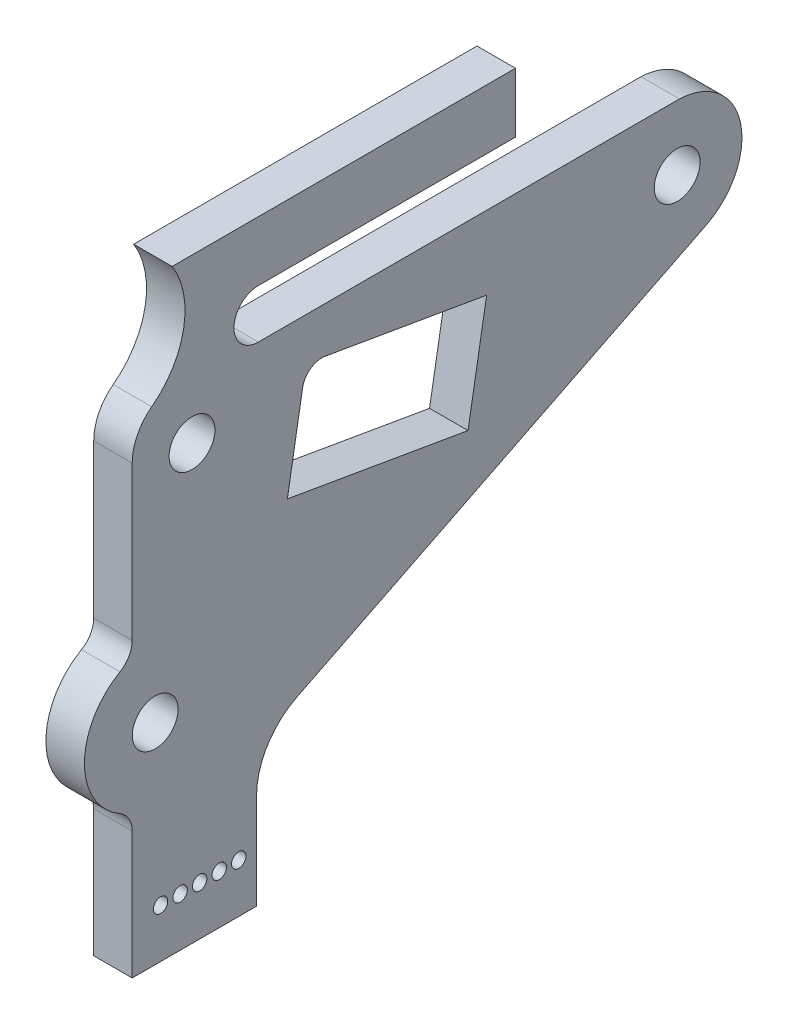
ISO-10303-21;
HEADER;
FILE_DESCRIPTION(('STEP AP214'),'2;1');
FILE_NAME('part.step','',(''),(''),'','','');
FILE_SCHEMA(('AUTOMOTIVE_DESIGN { 1 0 10303 214 1 1 1 1 }'));
ENDSEC;
DATA;
#1=APPLICATION_CONTEXT('core data for automotive mechanical design processes');
#2=APPLICATION_PROTOCOL_DEFINITION('international standard','automotive_design',2000,#1);
#3=PRODUCT_CONTEXT('',#1,'mechanical');
#4=PRODUCT('Part','Part','',(#3));
#5=PRODUCT_RELATED_PRODUCT_CATEGORY('part','',(#4));
#6=PRODUCT_DEFINITION_FORMATION('','',#4);
#7=PRODUCT_DEFINITION_CONTEXT('part definition',#1,'design');
#8=PRODUCT_DEFINITION('design','',#6,#7);
#9=PRODUCT_DEFINITION_SHAPE('','',#8);
#10=(LENGTH_UNIT() NAMED_UNIT(*) SI_UNIT(.MILLI.,.METRE.));
#11=(NAMED_UNIT(*) PLANE_ANGLE_UNIT() SI_UNIT($,.RADIAN.));
#12=(NAMED_UNIT(*) SI_UNIT($,.STERADIAN.) SOLID_ANGLE_UNIT());
#13=UNCERTAINTY_MEASURE_WITH_UNIT(LENGTH_MEASURE(1.E-05),#10,'distance_accuracy_value','');
#14=(GEOMETRIC_REPRESENTATION_CONTEXT(3) GLOBAL_UNCERTAINTY_ASSIGNED_CONTEXT((#13)) GLOBAL_UNIT_ASSIGNED_CONTEXT((#10,
#11,#12)) REPRESENTATION_CONTEXT('',''));
#15=CARTESIAN_POINT('',(0.,0.,0.));
#16=DIRECTION('',(0.,0.,1.));
#17=DIRECTION('',(1.,0.,0.));
#18=AXIS2_PLACEMENT_3D('',#15,#16,#17);
#19=CARTESIAN_POINT('',(2.,2.38699131838962,51.5454002273468));
#20=DIRECTION('',(-1.,0.,0.));
#21=DIRECTION('',(0.,0.,1.));
#22=AXIS2_PLACEMENT_3D('',#19,#20,#21);
#23=PLANE('',#22);
#24=CARTESIAN_POINT('',(2.,-38.8637496349809,53.6810864751904));
#25=DIRECTION('',(1.,0.,0.));
#26=DIRECTION('',(0.,0.,-1.));
#27=AXIS2_PLACEMENT_3D('',#24,#25,#26);
#28=CIRCLE('',#27,0.749999999999999);
#29=CARTESIAN_POINT('',(2.,-38.8637496349809,52.9310864751904));
#30=VERTEX_POINT('',#29);
#31=EDGE_CURVE('E233',#30,#30,#28,.T.);
#32=ORIENTED_EDGE('',*,*,#31,.F.);
#33=EDGE_LOOP('',(#32));
#34=FACE_BOUND('',#33,.T.);
#35=CARTESIAN_POINT('',(2.,0.,0.));
#36=DIRECTION('',(1.,0.,0.));
#37=DIRECTION('',(0.,0.,-1.));
#38=AXIS2_PLACEMENT_3D('',#35,#36,#37);
#39=CIRCLE('',#38,2.38125);
#40=CARTESIAN_POINT('',(2.,0.,-2.38125));
#41=VERTEX_POINT('',#40);
#42=EDGE_CURVE('E239',#41,#41,#39,.T.);
#43=ORIENTED_EDGE('',*,*,#42,.F.);
#44=EDGE_LOOP('',(#43));
#45=FACE_BOUND('',#44,.T.);
#46=CARTESIAN_POINT('',(2.,2.38699131838962,51.5454002273468));
#47=DIRECTION('',(1.,0.,0.));
#48=DIRECTION('',(0.,0.,1.));
#49=AXIS2_PLACEMENT_3D('',#46,#47,#48);
#50=CIRCLE('',#49,5.08);
#51=CARTESIAN_POINT('',(2.,6.4482806199041,54.5970111477303));
#52=VERTEX_POINT('',#51);
#53=CARTESIAN_POINT('',(2.,2.38699131838962,56.6254002273468));
#54=VERTEX_POINT('',#53);
#55=EDGE_CURVE('E245',#52,#54,#50,.T.);
#56=ORIENTED_EDGE('',*,*,#55,.T.);
#57=DIRECTION('',(0.,-1.,0.));
#58=VECTOR('',#57,1.);
#59=CARTESIAN_POINT('',(2.,2.38699131838962,56.6254002273468));
#60=LINE('',#59,#58);
#61=CARTESIAN_POINT('',(2.,-13.5592215366912,56.6254002273468));
#62=VERTEX_POINT('',#61);
#63=EDGE_CURVE('E248',#54,#62,#60,.T.);
#64=ORIENTED_EDGE('',*,*,#63,.T.);
#65=CARTESIAN_POINT('',(2.,-13.5592215366912,59.1654002273468));
#66=DIRECTION('',(-1.,0.,0.));
#67=DIRECTION('',(0.,0.,1.));
#68=AXIS2_PLACEMENT_3D('',#65,#66,#67);
#69=CIRCLE('',#68,2.54);
#70=CARTESIAN_POINT('',(2.,-15.7615105365102,57.8998872241437));
#71=VERTEX_POINT('',#70);
#72=EDGE_CURVE('E251',#62,#71,#69,.T.);
#73=ORIENTED_EDGE('',*,*,#72,.T.);
#74=CARTESIAN_POINT('',(2.,-22.137211246104,54.2361845251858));
#75=DIRECTION('',(1.,0.,0.));
#76=DIRECTION('',(0.,0.,-1.));
#77=AXIS2_PLACEMENT_3D('',#74,#75,#76);
#78=CIRCLE('',#77,7.35338541113316);
#79=CARTESIAN_POINT('',(2.,-28.5129119556978,57.8998872241436));
#80=VERTEX_POINT('',#79);
#81=EDGE_CURVE('E253',#71,#80,#78,.T.);
#82=ORIENTED_EDGE('',*,*,#81,.T.);
#83=CARTESIAN_POINT('',(2.,-30.7152009555168,59.1654002273467));
#84=DIRECTION('',(-1.,0.,0.));
#85=DIRECTION('',(0.,0.,-1.));
#86=AXIS2_PLACEMENT_3D('',#83,#84,#85);
#87=CIRCLE('',#86,2.54);
#88=CARTESIAN_POINT('',(2.,-30.7152009555168,56.6254002273467));
#89=VERTEX_POINT('',#88);
#90=EDGE_CURVE('E255',#80,#89,#87,.T.);
#91=ORIENTED_EDGE('',*,*,#90,.T.);
#92=DIRECTION('',(0.,-1.,0.));
#93=VECTOR('',#92,1.);
#94=CARTESIAN_POINT('',(2.,-30.7152009555168,56.6254002273467));
#95=LINE('',#94,#93);
#96=CARTESIAN_POINT('',(2.,-43.9437496349808,56.6254002273467));
#97=VERTEX_POINT('',#96);
#98=EDGE_CURVE('E257',#89,#97,#95,.T.);
#99=ORIENTED_EDGE('',*,*,#98,.T.);
#100=DIRECTION('',(0.,0.,-1.));
#101=VECTOR('',#100,1.);
#102=CARTESIAN_POINT('',(2.,-43.9437496349808,56.6254002273467));
#103=LINE('',#102,#101);
#104=CARTESIAN_POINT('',(2.,-43.9437496349808,43.7075206472883));
#105=VERTEX_POINT('',#104);
#106=EDGE_CURVE('E259',#97,#105,#103,.T.);
#107=ORIENTED_EDGE('',*,*,#106,.T.);
#108=DIRECTION('',(0.,1.,0.));
#109=VECTOR('',#108,1.);
#110=CARTESIAN_POINT('',(2.,-43.9437496349808,43.7075206472883));
#111=LINE('',#110,#109);
#112=CARTESIAN_POINT('',(2.,-34.03041401143,43.7075206472883));
#113=VERTEX_POINT('',#112);
#114=EDGE_CURVE('E261',#105,#113,#111,.T.);
#115=ORIENTED_EDGE('',*,*,#114,.T.);
#116=CARTESIAN_POINT('',(2.,-34.03041401143,36.0875206472883));
#117=DIRECTION('',(-1.,0.,0.));
#118=DIRECTION('',(0.,0.,1.));
#119=AXIS2_PLACEMENT_3D('',#116,#117,#118);
#120=CIRCLE('',#119,7.62);
#121=CARTESIAN_POINT('',(2.,-27.2112146301632,39.4879500023156));
#122=VERTEX_POINT('',#121);
#123=EDGE_CURVE('E263',#113,#122,#120,.T.);
#124=ORIENTED_EDGE('',*,*,#123,.T.);
#125=DIRECTION('',(0.,0.446250571525895,-0.894908055284347));
#126=VECTOR('',#125,1.);
#127=CARTESIAN_POINT('',(2.,-20.3900423288693,25.8088144932282));
#128=LINE('',#127,#126);
#129=CARTESIAN_POINT('',(2.,-6.02274455486092,-3.00327299982475));
#130=VERTEX_POINT('',#129);
#131=EDGE_CURVE('E265',#122,#130,#128,.T.);
#132=ORIENTED_EDGE('',*,*,#131,.T.);
#133=CARTESIAN_POINT('',(2.,0.,0.));
#134=DIRECTION('',(1.,0.,0.));
#135=DIRECTION('',(0.,0.,1.));
#136=AXIS2_PLACEMENT_3D('',#133,#134,#135);
#137=CIRCLE('',#136,6.73001490968506);
#138=CARTESIAN_POINT('',(2.,6.72598374953626,-0.232901879677734));
#139=VERTEX_POINT('',#138);
#140=EDGE_CURVE('E267',#130,#139,#137,.T.);
#141=ORIENTED_EDGE('',*,*,#140,.T.);
#142=DIRECTION('',(0.,0.,1.));
#143=VECTOR('',#142,1.);
#144=CARTESIAN_POINT('',(2.,6.72598374953626,43.5151442643136));
#145=LINE('',#144,#143);
#146=CARTESIAN_POINT('',(2.,6.72598374953626,43.5151442643136));
#147=VERTEX_POINT('',#146);
#148=EDGE_CURVE('E269',#139,#147,#145,.T.);
#149=ORIENTED_EDGE('',*,*,#148,.T.);
#150=CARTESIAN_POINT('',(2.,9.26598374953626,43.5151442643136));
#151=DIRECTION('',(-1.,0.,0.));
#152=DIRECTION('',(0.,0.,1.));
#153=AXIS2_PLACEMENT_3D('',#150,#151,#152);
#154=CIRCLE('',#153,2.54);
#155=CARTESIAN_POINT('',(2.,11.8059837495363,43.5151442643136));
#156=VERTEX_POINT('',#155);
#157=EDGE_CURVE('E271',#147,#156,#154,.T.);
#158=ORIENTED_EDGE('',*,*,#157,.T.);
#159=DIRECTION('',(0.,0.,-1.));
#160=VECTOR('',#159,1.);
#161=CARTESIAN_POINT('',(2.,11.8059837495363,43.5151442643136));
#162=LINE('',#161,#160);
#163=CARTESIAN_POINT('',(2.,11.8059837495363,16.8039920927754));
#164=VERTEX_POINT('',#163);
#165=EDGE_CURVE('E273',#156,#164,#162,.T.);
#166=ORIENTED_EDGE('',*,*,#165,.T.);
#167=DIRECTION('',(0.,1.,0.));
#168=VECTOR('',#167,1.);
#169=CARTESIAN_POINT('',(2.,11.8059837495363,16.8039920927754));
#170=LINE('',#169,#168);
#171=CARTESIAN_POINT('',(2.,18.0090250290164,16.8039920927754));
#172=VERTEX_POINT('',#171);
#173=EDGE_CURVE('E275',#164,#172,#170,.T.);
#174=ORIENTED_EDGE('',*,*,#173,.T.);
#175=DIRECTION('',(0.,0.,1.));
#176=VECTOR('',#175,1.);
#177=CARTESIAN_POINT('',(2.,18.0090250290164,16.8039920927754));
#178=LINE('',#177,#176);
#179=CARTESIAN_POINT('',(2.,18.0090250290164,52.4757765292634));
#180=VERTEX_POINT('',#179);
#181=EDGE_CURVE('E277',#172,#180,#178,.T.);
#182=ORIENTED_EDGE('',*,*,#181,.T.);
#183=CARTESIAN_POINT('',(2.,13.3787632863439,59.8045043889899));
#184=DIRECTION('',(-1.,0.,0.));
#185=DIRECTION('',(0.,0.,1.));
#186=AXIS2_PLACEMENT_3D('',#183,#184,#185);
#187=CIRCLE('',#186,8.66888550204626);
#188=EDGE_CURVE('E279',#180,#52,#187,.T.);
#189=ORIENTED_EDGE('',*,*,#188,.T.);
#190=EDGE_LOOP('',(#56,#64,#73,#82,#91,#99,#107,#115,#124,#132,#141,#149,#158,#166,#174,#182,#189));
#191=FACE_BOUND('',#190,.T.);
#192=DIRECTION('',(0.,0.985468507772832,-0.169858235561272));
#193=VECTOR('',#192,1.);
#194=CARTESIAN_POINT('',(2.,-0.914638547086267,19.7976944461285));
#195=LINE('',#194,#193);
#196=CARTESIAN_POINT('',(2.,-12.1305272597709,21.7308978432555));
#197=VERTEX_POINT('',#196);
#198=CARTESIAN_POINT('',(2.,-0.914638547086267,19.7976944461285));
#199=VERTEX_POINT('',#198);
#200=EDGE_CURVE('E186',#197,#199,#195,.T.);
#201=ORIENTED_EDGE('',*,*,#200,.F.);
#202=DIRECTION('',(0.,-0.169858235561271,-0.985468507772832));
#203=VECTOR('',#202,1.);
#204=CARTESIAN_POINT('',(2.,-8.89472787232872,40.504072916328));
#205=LINE('',#204,#203);
#206=CARTESIAN_POINT('',(2.,-8.89472787232872,40.504072916328));
#207=VERTEX_POINT('',#206);
#208=EDGE_CURVE('E215',#207,#197,#205,.T.);
#209=ORIENTED_EDGE('',*,*,#208,.F.);
#210=DIRECTION('',(0.,-0.985468507772832,0.169858235561271));
#211=VECTOR('',#210,1.);
#212=CARTESIAN_POINT('',(2.,0.318688832561539,38.9160214538614));
#213=LINE('',#212,#211);
#214=CARTESIAN_POINT('',(2.,0.318688832561539,38.9160214538614));
#215=VERTEX_POINT('',#214);
#216=EDGE_CURVE('E210',#215,#207,#213,.T.);
#217=ORIENTED_EDGE('',*,*,#216,.F.);
#218=CARTESIAN_POINT('',(2.,-0.02646310209895,36.913549446067));
#219=DIRECTION('',(1.,0.,0.));
#220=DIRECTION('',(0.,0.,1.));
#221=AXIS2_PLACEMENT_3D('',#218,#219,#220);
#222=CIRCLE('',#221,2.032);
#223=CARTESIAN_POINT('',(2.,1.97600890569544,36.5683975114065));
#224=VERTEX_POINT('',#223);
#225=EDGE_CURVE('E208',#224,#215,#222,.T.);
#226=ORIENTED_EDGE('',*,*,#225,.F.);
#227=DIRECTION('',(0.,0.169858235561271,0.985468507772832));
#228=VECTOR('',#227,1.);
#229=CARTESIAN_POINT('',(2.,1.97600890569544,36.5683975114065));
#230=LINE('',#229,#228);
#231=EDGE_CURVE('E194',#199,#224,#230,.T.);
#232=ORIENTED_EDGE('',*,*,#231,.F.);
#233=EDGE_LOOP('',(#201,#209,#217,#226,#232));
#234=FACE_BOUND('',#233,.T.);
#235=CARTESIAN_POINT('',(2.,-38.8637496349808,45.5530864751904));
#236=DIRECTION('',(1.,0.,0.));
#237=DIRECTION('',(0.,0.,-1.));
#238=AXIS2_PLACEMENT_3D('',#235,#236,#237);
#239=CIRCLE('',#238,0.749999999999999);
#240=CARTESIAN_POINT('',(2.,-38.8637496349808,44.8030864751904));
#241=VERTEX_POINT('',#240);
#242=EDGE_CURVE('E218',#241,#241,#239,.T.);
#243=ORIENTED_EDGE('',*,*,#242,.F.);
#244=EDGE_LOOP('',(#243));
#245=FACE_BOUND('',#244,.T.);
#246=CARTESIAN_POINT('',(2.,-22.137211246104,54.2361845251858));
#247=DIRECTION('',(1.,0.,0.));
#248=DIRECTION('',(0.,0.,-1.));
#249=AXIS2_PLACEMENT_3D('',#246,#247,#248);
#250=CIRCLE('',#249,2.38125);
#251=CARTESIAN_POINT('',(2.,-22.137211246104,51.8549345251858));
#252=VERTEX_POINT('',#251);
#253=EDGE_CURVE('E757',#252,#252,#250,.T.);
#254=ORIENTED_EDGE('',*,*,#253,.F.);
#255=EDGE_LOOP('',(#254));
#256=FACE_BOUND('',#255,.T.);
#257=CARTESIAN_POINT('',(2.,-38.8637496349808,47.5850864751904));
#258=DIRECTION('',(1.,0.,0.));
#259=DIRECTION('',(0.,0.,-1.));
#260=AXIS2_PLACEMENT_3D('',#257,#258,#259);
#261=CIRCLE('',#260,0.749999999999999);
#262=CARTESIAN_POINT('',(2.,-38.8637496349808,46.8350864751904));
#263=VERTEX_POINT('',#262);
#264=EDGE_CURVE('E751',#263,#263,#261,.T.);
#265=ORIENTED_EDGE('',*,*,#264,.F.);
#266=EDGE_LOOP('',(#265));
#267=FACE_BOUND('',#266,.T.);
#268=CARTESIAN_POINT('',(2.,-38.8637496349808,49.6170864751904));
#269=DIRECTION('',(1.,0.,0.));
#270=DIRECTION('',(0.,0.,-1.));
#271=AXIS2_PLACEMENT_3D('',#268,#269,#270);
#272=CIRCLE('',#271,0.749999999999999);
#273=CARTESIAN_POINT('',(2.,-38.8637496349808,48.8670864751904));
#274=VERTEX_POINT('',#273);
#275=EDGE_CURVE('E745',#274,#274,#272,.T.);
#276=ORIENTED_EDGE('',*,*,#275,.F.);
#277=EDGE_LOOP('',(#276));
#278=FACE_BOUND('',#277,.T.);
#279=CARTESIAN_POINT('',(2.,-38.8637496349809,51.6490864751904));
#280=DIRECTION('',(1.,0.,0.));
#281=DIRECTION('',(0.,0.,-1.));
#282=AXIS2_PLACEMENT_3D('',#279,#280,#281);
#283=CIRCLE('',#282,0.749999999999999);
#284=CARTESIAN_POINT('',(2.,-38.8637496349809,50.8990864751904));
#285=VERTEX_POINT('',#284);
#286=EDGE_CURVE('E739',#285,#285,#283,.T.);
#287=ORIENTED_EDGE('',*,*,#286,.F.);
#288=EDGE_LOOP('',(#287));
#289=FACE_BOUND('',#288,.T.);
#290=CARTESIAN_POINT('',(2.,1.07937569190719,50.4101289105847));
#291=DIRECTION('',(1.,0.,0.));
#292=DIRECTION('',(0.,0.,-1.));
#293=AXIS2_PLACEMENT_3D('',#290,#291,#292);
#294=CIRCLE('',#293,2.38125);
#295=CARTESIAN_POINT('',(2.,1.07937569190719,48.0288789105847));
#296=VERTEX_POINT('',#295);
#297=EDGE_CURVE('E730',#296,#296,#294,.T.);
#298=ORIENTED_EDGE('',*,*,#297,.F.);
#299=EDGE_LOOP('',(#298));
#300=FACE_BOUND('',#299,.T.);
#301=ADVANCED_FACE('F37',(#34,#45,#191,#234,#245,#256,#267,#278,#289,#300),#23,.F.);
#302=CARTESIAN_POINT('',(-2.,2.38699131838962,51.5454002273468));
#303=DIRECTION('',(-1.,0.,0.));
#304=DIRECTION('',(0.,0.,1.));
#305=AXIS2_PLACEMENT_3D('',#302,#303,#304);
#306=PLANE('',#305);
#307=CARTESIAN_POINT('',(-2.,-38.8637496349809,51.6490864751904));
#308=DIRECTION('',(1.,0.,0.));
#309=DIRECTION('',(0.,0.,-1.));
#310=AXIS2_PLACEMENT_3D('',#307,#308,#309);
#311=CIRCLE('',#310,0.749999999999999);
#312=CARTESIAN_POINT('',(-2.,-38.8637496349809,50.8990864751904));
#313=VERTEX_POINT('',#312);
#314=EDGE_CURVE('E736',#313,#313,#311,.T.);
#315=ORIENTED_EDGE('',*,*,#314,.T.);
#316=EDGE_LOOP('',(#315));
#317=FACE_BOUND('',#316,.T.);
#318=CARTESIAN_POINT('',(-2.,-38.8637496349808,47.5850864751904));
#319=DIRECTION('',(1.,0.,0.));
#320=DIRECTION('',(0.,0.,-1.));
#321=AXIS2_PLACEMENT_3D('',#318,#319,#320);
#322=CIRCLE('',#321,0.749999999999999);
#323=CARTESIAN_POINT('',(-2.,-38.8637496349808,46.8350864751904));
#324=VERTEX_POINT('',#323);
#325=EDGE_CURVE('E748',#324,#324,#322,.T.);
#326=ORIENTED_EDGE('',*,*,#325,.T.);
#327=EDGE_LOOP('',(#326));
#328=FACE_BOUND('',#327,.T.);
#329=CARTESIAN_POINT('',(-2.,-38.8637496349808,45.5530864751904));
#330=DIRECTION('',(1.,0.,0.));
#331=DIRECTION('',(0.,0.,-1.));
#332=AXIS2_PLACEMENT_3D('',#329,#330,#331);
#333=CIRCLE('',#332,0.749999999999999);
#334=CARTESIAN_POINT('',(-2.,-38.8637496349808,44.8030864751904));
#335=VERTEX_POINT('',#334);
#336=EDGE_CURVE('E760',#335,#335,#333,.T.);
#337=ORIENTED_EDGE('',*,*,#336,.T.);
#338=EDGE_LOOP('',(#337));
#339=FACE_BOUND('',#338,.T.);
#340=CARTESIAN_POINT('',(-2.,0.,0.));
#341=DIRECTION('',(1.,0.,0.));
#342=DIRECTION('',(0.,0.,-1.));
#343=AXIS2_PLACEMENT_3D('',#340,#341,#342);
#344=CIRCLE('',#343,2.38125);
#345=CARTESIAN_POINT('',(-2.,0.,-2.38125));
#346=VERTEX_POINT('',#345);
#347=EDGE_CURVE('E236',#346,#346,#344,.T.);
#348=ORIENTED_EDGE('',*,*,#347,.T.);
#349=EDGE_LOOP('',(#348));
#350=FACE_BOUND('',#349,.T.);
#351=CARTESIAN_POINT('',(-2.,2.38699131838962,51.5454002273468));
#352=DIRECTION('',(1.,0.,0.));
#353=DIRECTION('',(0.,0.,1.));
#354=AXIS2_PLACEMENT_3D('',#351,#352,#353);
#355=CIRCLE('',#354,5.08);
#356=CARTESIAN_POINT('',(-2.,6.4482806199041,54.5970111477303));
#357=VERTEX_POINT('',#356);
#358=CARTESIAN_POINT('',(-2.,2.38699131838962,56.6254002273468));
#359=VERTEX_POINT('',#358);
#360=EDGE_CURVE('E242',#357,#359,#355,.T.);
#361=ORIENTED_EDGE('',*,*,#360,.F.);
#362=CARTESIAN_POINT('',(-2.,13.3787632863439,59.8045043889899));
#363=DIRECTION('',(-1.,0.,0.));
#364=DIRECTION('',(0.,0.,1.));
#365=AXIS2_PLACEMENT_3D('',#362,#363,#364);
#366=CIRCLE('',#365,8.66888550204626);
#367=CARTESIAN_POINT('',(-2.,18.0090250290164,52.4757765292634));
#368=VERTEX_POINT('',#367);
#369=EDGE_CURVE('E249',#368,#357,#366,.T.);
#370=ORIENTED_EDGE('',*,*,#369,.F.);
#371=DIRECTION('',(0.,0.,1.));
#372=VECTOR('',#371,1.);
#373=CARTESIAN_POINT('',(-2.,18.0090250290164,16.8039920927754));
#374=LINE('',#373,#372);
#375=CARTESIAN_POINT('',(-2.,18.0090250290164,16.8039920927754));
#376=VERTEX_POINT('',#375);
#377=EDGE_CURVE('E313',#376,#368,#374,.T.);
#378=ORIENTED_EDGE('',*,*,#377,.F.);
#379=DIRECTION('',(0.,1.,0.));
#380=VECTOR('',#379,1.);
#381=CARTESIAN_POINT('',(-2.,11.8059837495363,16.8039920927754));
#382=LINE('',#381,#380);
#383=CARTESIAN_POINT('',(-2.,11.8059837495363,16.8039920927754));
#384=VERTEX_POINT('',#383);
#385=EDGE_CURVE('E311',#384,#376,#382,.T.);
#386=ORIENTED_EDGE('',*,*,#385,.F.);
#387=DIRECTION('',(0.,0.,-1.));
#388=VECTOR('',#387,1.);
#389=CARTESIAN_POINT('',(-2.,11.8059837495363,43.5151442643136));
#390=LINE('',#389,#388);
#391=CARTESIAN_POINT('',(-2.,11.8059837495363,43.5151442643136));
#392=VERTEX_POINT('',#391);
#393=EDGE_CURVE('E309',#392,#384,#390,.T.);
#394=ORIENTED_EDGE('',*,*,#393,.F.);
#395=CARTESIAN_POINT('',(-2.,9.26598374953626,43.5151442643136));
#396=DIRECTION('',(-1.,0.,0.));
#397=DIRECTION('',(0.,0.,1.));
#398=AXIS2_PLACEMENT_3D('',#395,#396,#397);
#399=CIRCLE('',#398,2.54);
#400=CARTESIAN_POINT('',(-2.,6.72598374953626,43.5151442643136));
#401=VERTEX_POINT('',#400);
#402=EDGE_CURVE('E307',#401,#392,#399,.T.);
#403=ORIENTED_EDGE('',*,*,#402,.F.);
#404=DIRECTION('',(0.,0.,1.));
#405=VECTOR('',#404,1.);
#406=CARTESIAN_POINT('',(-2.,6.72598374953626,43.5151442643136));
#407=LINE('',#406,#405);
#408=CARTESIAN_POINT('',(-2.,6.72598374953626,-0.232901879677734));
#409=VERTEX_POINT('',#408);
#410=EDGE_CURVE('E305',#409,#401,#407,.T.);
#411=ORIENTED_EDGE('',*,*,#410,.F.);
#412=CARTESIAN_POINT('',(-2.,0.,0.));
#413=DIRECTION('',(1.,0.,0.));
#414=DIRECTION('',(0.,0.,1.));
#415=AXIS2_PLACEMENT_3D('',#412,#413,#414);
#416=CIRCLE('',#415,6.73001490968506);
#417=CARTESIAN_POINT('',(-2.,-6.02274455486092,-3.00327299982475));
#418=VERTEX_POINT('',#417);
#419=EDGE_CURVE('E303',#418,#409,#416,.T.);
#420=ORIENTED_EDGE('',*,*,#419,.F.);
#421=DIRECTION('',(0.,0.446250571525895,-0.894908055284347));
#422=VECTOR('',#421,1.);
#423=CARTESIAN_POINT('',(-2.,-20.3900423288693,25.8088144932282));
#424=LINE('',#423,#422);
#425=CARTESIAN_POINT('',(-2.,-27.2112146301632,39.4879500023156));
#426=VERTEX_POINT('',#425);
#427=EDGE_CURVE('E301',#426,#418,#424,.T.);
#428=ORIENTED_EDGE('',*,*,#427,.F.);
#429=CARTESIAN_POINT('',(-2.,-34.03041401143,36.0875206472883));
#430=DIRECTION('',(-1.,0.,0.));
#431=DIRECTION('',(0.,0.,1.));
#432=AXIS2_PLACEMENT_3D('',#429,#430,#431);
#433=CIRCLE('',#432,7.62);
#434=CARTESIAN_POINT('',(-2.,-34.03041401143,43.7075206472883));
#435=VERTEX_POINT('',#434);
#436=EDGE_CURVE('E298',#435,#426,#433,.T.);
#437=ORIENTED_EDGE('',*,*,#436,.F.);
#438=DIRECTION('',(0.,1.,0.));
#439=VECTOR('',#438,1.);
#440=CARTESIAN_POINT('',(-2.,-43.9437496349808,43.7075206472883));
#441=LINE('',#440,#439);
#442=CARTESIAN_POINT('',(-2.,-43.9437496349808,43.7075206472883));
#443=VERTEX_POINT('',#442);
#444=EDGE_CURVE('E296',#443,#435,#441,.T.);
#445=ORIENTED_EDGE('',*,*,#444,.F.);
#446=DIRECTION('',(0.,0.,-1.));
#447=VECTOR('',#446,1.);
#448=CARTESIAN_POINT('',(-2.,-43.9437496349808,56.6254002273467));
#449=LINE('',#448,#447);
#450=CARTESIAN_POINT('',(-2.,-43.9437496349808,56.6254002273467));
#451=VERTEX_POINT('',#450);
#452=EDGE_CURVE('E294',#451,#443,#449,.T.);
#453=ORIENTED_EDGE('',*,*,#452,.F.);
#454=DIRECTION('',(0.,-1.,0.));
#455=VECTOR('',#454,1.);
#456=CARTESIAN_POINT('',(-2.,-30.7152009555168,56.6254002273467));
#457=LINE('',#456,#455);
#458=CARTESIAN_POINT('',(-2.,-30.7152009555168,56.6254002273467));
#459=VERTEX_POINT('',#458);
#460=EDGE_CURVE('E292',#459,#451,#457,.T.);
#461=ORIENTED_EDGE('',*,*,#460,.F.);
#462=CARTESIAN_POINT('',(-2.,-30.7152009555168,59.1654002273467));
#463=DIRECTION('',(-1.,0.,0.));
#464=DIRECTION('',(0.,0.,-1.));
#465=AXIS2_PLACEMENT_3D('',#462,#463,#464);
#466=CIRCLE('',#465,2.54);
#467=CARTESIAN_POINT('',(-2.,-28.5129119556978,57.8998872241436));
#468=VERTEX_POINT('',#467);
#469=EDGE_CURVE('E290',#468,#459,#466,.T.);
#470=ORIENTED_EDGE('',*,*,#469,.F.);
#471=CARTESIAN_POINT('',(-2.,-22.137211246104,54.2361845251858));
#472=DIRECTION('',(1.,0.,0.));
#473=DIRECTION('',(0.,0.,-1.));
#474=AXIS2_PLACEMENT_3D('',#471,#472,#473);
#475=CIRCLE('',#474,7.35338541113316);
#476=CARTESIAN_POINT('',(-2.,-15.7615105365102,57.8998872241437));
#477=VERTEX_POINT('',#476);
#478=EDGE_CURVE('E288',#477,#468,#475,.T.);
#479=ORIENTED_EDGE('',*,*,#478,.F.);
#480=CARTESIAN_POINT('',(-2.,-13.5592215366912,59.1654002273468));
#481=DIRECTION('',(-1.,0.,0.));
#482=DIRECTION('',(0.,0.,1.));
#483=AXIS2_PLACEMENT_3D('',#480,#481,#482);
#484=CIRCLE('',#483,2.54);
#485=CARTESIAN_POINT('',(-2.,-13.5592215366912,56.6254002273468));
#486=VERTEX_POINT('',#485);
#487=EDGE_CURVE('E286',#486,#477,#484,.T.);
#488=ORIENTED_EDGE('',*,*,#487,.F.);
#489=DIRECTION('',(0.,-1.,0.));
#490=VECTOR('',#489,1.);
#491=CARTESIAN_POINT('',(-2.,2.38699131838962,56.6254002273468));
#492=LINE('',#491,#490);
#493=EDGE_CURVE('E284',#359,#486,#492,.T.);
#494=ORIENTED_EDGE('',*,*,#493,.F.);
#495=EDGE_LOOP('',(#361,#370,#378,#386,#394,#403,#411,#420,#428,#437,#445,#453,#461,#470,#479,
#488,#494));
#496=FACE_BOUND('',#495,.T.);
#497=CARTESIAN_POINT('',(-2.,-38.8637496349809,53.6810864751904));
#498=DIRECTION('',(1.,0.,0.));
#499=DIRECTION('',(0.,0.,-1.));
#500=AXIS2_PLACEMENT_3D('',#497,#498,#499);
#501=CIRCLE('',#500,0.749999999999999);
#502=CARTESIAN_POINT('',(-2.,-38.8637496349809,52.9310864751904));
#503=VERTEX_POINT('',#502);
#504=EDGE_CURVE('E202',#503,#503,#501,.T.);
#505=ORIENTED_EDGE('',*,*,#504,.T.);
#506=EDGE_LOOP('',(#505));
#507=FACE_BOUND('',#506,.T.);
#508=DIRECTION('',(0.,-0.169858235561271,-0.985468507772832));
#509=VECTOR('',#508,1.);
#510=CARTESIAN_POINT('',(-2.,-8.89472787232872,40.504072916328));
#511=LINE('',#510,#509);
#512=CARTESIAN_POINT('',(-2.,-8.89472787232872,40.504072916328));
#513=VERTEX_POINT('',#512);
#514=CARTESIAN_POINT('',(-2.,-12.1305272597709,21.7308978432555));
#515=VERTEX_POINT('',#514);
#516=EDGE_CURVE('E195',#513,#515,#511,.T.);
#517=ORIENTED_EDGE('',*,*,#516,.T.);
#518=DIRECTION('',(0.,0.985468507772832,-0.169858235561272));
#519=VECTOR('',#518,1.);
#520=CARTESIAN_POINT('',(-2.,-0.914638547086267,19.7976944461285));
#521=LINE('',#520,#519);
#522=CARTESIAN_POINT('',(-2.,-0.914638547086267,19.7976944461285));
#523=VERTEX_POINT('',#522);
#524=EDGE_CURVE('E60',#515,#523,#521,.T.);
#525=ORIENTED_EDGE('',*,*,#524,.T.);
#526=DIRECTION('',(0.,0.169858235561271,0.985468507772832));
#527=VECTOR('',#526,1.);
#528=CARTESIAN_POINT('',(-2.,1.97600890569544,36.5683975114065));
#529=LINE('',#528,#527);
#530=CARTESIAN_POINT('',(-2.,1.97600890569544,36.5683975114065));
#531=VERTEX_POINT('',#530);
#532=EDGE_CURVE('E201',#523,#531,#529,.T.);
#533=ORIENTED_EDGE('',*,*,#532,.T.);
#534=CARTESIAN_POINT('',(-2.,-0.02646310209895,36.913549446067));
#535=DIRECTION('',(1.,0.,0.));
#536=DIRECTION('',(0.,0.,1.));
#537=AXIS2_PLACEMENT_3D('',#534,#535,#536);
#538=CIRCLE('',#537,2.032);
#539=CARTESIAN_POINT('',(-2.,0.318688832561539,38.9160214538614));
#540=VERTEX_POINT('',#539);
#541=EDGE_CURVE('E220',#531,#540,#538,.T.);
#542=ORIENTED_EDGE('',*,*,#541,.T.);
#543=DIRECTION('',(0.,-0.985468507772832,0.169858235561271));
#544=VECTOR('',#543,1.);
#545=CARTESIAN_POINT('',(-2.,0.318688832561539,38.9160214538614));
#546=LINE('',#545,#544);
#547=EDGE_CURVE('E223',#540,#513,#546,.T.);
#548=ORIENTED_EDGE('',*,*,#547,.T.);
#549=EDGE_LOOP('',(#517,#525,#533,#542,#548));
#550=FACE_BOUND('',#549,.T.);
#551=CARTESIAN_POINT('',(-2.,-22.137211246104,54.2361845251858));
#552=DIRECTION('',(1.,0.,0.));
#553=DIRECTION('',(0.,0.,-1.));
#554=AXIS2_PLACEMENT_3D('',#551,#552,#553);
#555=CIRCLE('',#554,2.38125);
#556=CARTESIAN_POINT('',(-2.,-22.137211246104,51.8549345251858));
#557=VERTEX_POINT('',#556);
#558=EDGE_CURVE('E754',#557,#557,#555,.T.);
#559=ORIENTED_EDGE('',*,*,#558,.T.);
#560=EDGE_LOOP('',(#559));
#561=FACE_BOUND('',#560,.T.);
#562=CARTESIAN_POINT('',(-2.,-38.8637496349808,49.6170864751904));
#563=DIRECTION('',(1.,0.,0.));
#564=DIRECTION('',(0.,0.,-1.));
#565=AXIS2_PLACEMENT_3D('',#562,#563,#564);
#566=CIRCLE('',#565,0.749999999999999);
#567=CARTESIAN_POINT('',(-2.,-38.8637496349808,48.8670864751904));
#568=VERTEX_POINT('',#567);
#569=EDGE_CURVE('E742',#568,#568,#566,.T.);
#570=ORIENTED_EDGE('',*,*,#569,.T.);
#571=EDGE_LOOP('',(#570));
#572=FACE_BOUND('',#571,.T.);
#573=CARTESIAN_POINT('',(-2.,1.07937569190719,50.4101289105847));
#574=DIRECTION('',(1.,0.,0.));
#575=DIRECTION('',(0.,0.,-1.));
#576=AXIS2_PLACEMENT_3D('',#573,#574,#575);
#577=CIRCLE('',#576,2.38125);
#578=CARTESIAN_POINT('',(-2.,1.07937569190719,48.0288789105847));
#579=VERTEX_POINT('',#578);
#580=EDGE_CURVE('E733',#579,#579,#577,.T.);
#581=ORIENTED_EDGE('',*,*,#580,.T.);
#582=EDGE_LOOP('',(#581));
#583=FACE_BOUND('',#582,.T.);
#584=ADVANCED_FACE('F370',(#317,#328,#339,#350,#496,#507,#550,#561,#572,#583),#306,.T.);
#585=CARTESIAN_POINT('',(2.,2.38699131838962,51.5454002273468));
#586=DIRECTION('',(-1.,0.,0.));
#587=DIRECTION('',(0.,0.,1.));
#588=AXIS2_PLACEMENT_3D('',#585,#586,#587);
#589=CYLINDRICAL_SURFACE('',#588,5.08);
#590=ORIENTED_EDGE('',*,*,#360,.T.);
#591=DIRECTION('',(-1.,0.,0.));
#592=VECTOR('',#591,1.);
#593=CARTESIAN_POINT('',(2.,2.38699131838962,56.6254002273468));
#594=LINE('',#593,#592);
#595=EDGE_CURVE('E11',#54,#359,#594,.T.);
#596=ORIENTED_EDGE('',*,*,#595,.F.);
#597=ORIENTED_EDGE('',*,*,#55,.F.);
#598=DIRECTION('',(-1.,0.,0.));
#599=VECTOR('',#598,1.);
#600=CARTESIAN_POINT('',(2.,6.4482806199041,54.5970111477303));
#601=LINE('',#600,#599);
#602=EDGE_CURVE('E281',#52,#357,#601,.T.);
#603=ORIENTED_EDGE('',*,*,#602,.T.);
#604=EDGE_LOOP('',(#590,#596,#597,#603));
#605=FACE_BOUND('',#604,.T.);
#606=ADVANCED_FACE('F39',(#605),#589,.T.);
#607=CARTESIAN_POINT('',(2.,2.38699131838962,56.6254002273468));
#608=DIRECTION('',(0.,0.,-1.));
#609=DIRECTION('',(-1.,0.,0.));
#610=AXIS2_PLACEMENT_3D('',#607,#608,#609);
#611=PLANE('',#610);
#612=ORIENTED_EDGE('',*,*,#493,.T.);
#613=DIRECTION('',(-1.,0.,0.));
#614=VECTOR('',#613,1.);
#615=CARTESIAN_POINT('',(2.,-13.5592215366912,56.6254002273468));
#616=LINE('',#615,#614);
#617=EDGE_CURVE('E45',#62,#486,#616,.T.);
#618=ORIENTED_EDGE('',*,*,#617,.F.);
#619=ORIENTED_EDGE('',*,*,#63,.F.);
#620=ORIENTED_EDGE('',*,*,#595,.T.);
#621=EDGE_LOOP('',(#612,#618,#619,#620));
#622=FACE_BOUND('',#621,.T.);
#623=ADVANCED_FACE('F387',(#622),#611,.F.);
#624=CARTESIAN_POINT('',(2.,-13.5592215366912,59.1654002273468));
#625=DIRECTION('',(-1.,0.,0.));
#626=DIRECTION('',(0.,0.,1.));
#627=AXIS2_PLACEMENT_3D('',#624,#625,#626);
#628=CYLINDRICAL_SURFACE('',#627,2.54);
#629=ORIENTED_EDGE('',*,*,#487,.T.);
#630=DIRECTION('',(-1.,0.,0.));
#631=VECTOR('',#630,1.);
#632=CARTESIAN_POINT('',(2.,-15.7615105365102,57.8998872241437));
#633=LINE('',#632,#631);
#634=EDGE_CURVE('E357',#71,#477,#633,.T.);
#635=ORIENTED_EDGE('',*,*,#634,.F.);
#636=ORIENTED_EDGE('',*,*,#72,.F.);
#637=ORIENTED_EDGE('',*,*,#617,.T.);
#638=EDGE_LOOP('',(#629,#635,#636,#637));
#639=FACE_BOUND('',#638,.T.);
#640=ADVANCED_FACE('F364',(#639),#628,.F.);
#641=CARTESIAN_POINT('',(2.,-22.137211246104,54.2361845251858));
#642=DIRECTION('',(-1.,0.,0.));
#643=DIRECTION('',(0.,0.,1.));
#644=AXIS2_PLACEMENT_3D('',#641,#642,#643);
#645=CYLINDRICAL_SURFACE('',#644,7.35338541113316);
#646=ORIENTED_EDGE('',*,*,#478,.T.);
#647=DIRECTION('',(-1.,0.,0.));
#648=VECTOR('',#647,1.);
#649=CARTESIAN_POINT('',(2.,-28.5129119556978,57.8998872241436));
#650=LINE('',#649,#648);
#651=EDGE_CURVE('E354',#80,#468,#650,.T.);
#652=ORIENTED_EDGE('',*,*,#651,.F.);
#653=ORIENTED_EDGE('',*,*,#81,.F.);
#654=ORIENTED_EDGE('',*,*,#634,.T.);
#655=EDGE_LOOP('',(#646,#652,#653,#654));
#656=FACE_BOUND('',#655,.T.);
#657=ADVANCED_FACE('F376',(#656),#645,.T.);
#658=CARTESIAN_POINT('',(2.,-30.7152009555168,59.1654002273467));
#659=DIRECTION('',(-1.,0.,0.));
#660=DIRECTION('',(0.,0.,1.));
#661=AXIS2_PLACEMENT_3D('',#658,#659,#660);
#662=CYLINDRICAL_SURFACE('',#661,2.54);
#663=ORIENTED_EDGE('',*,*,#469,.T.);
#664=DIRECTION('',(-1.,0.,0.));
#665=VECTOR('',#664,1.);
#666=CARTESIAN_POINT('',(2.,-30.7152009555168,56.6254002273467));
#667=LINE('',#666,#665);
#668=EDGE_CURVE('E351',#89,#459,#667,.T.);
#669=ORIENTED_EDGE('',*,*,#668,.F.);
#670=ORIENTED_EDGE('',*,*,#90,.F.);
#671=ORIENTED_EDGE('',*,*,#651,.T.);
#672=EDGE_LOOP('',(#663,#669,#670,#671));
#673=FACE_BOUND('',#672,.T.);
#674=ADVANCED_FACE('F380',(#673),#662,.F.);
#675=CARTESIAN_POINT('',(2.,-30.7152009555168,56.6254002273467));
#676=DIRECTION('',(0.,0.,-1.));
#677=DIRECTION('',(-1.,0.,0.));
#678=AXIS2_PLACEMENT_3D('',#675,#676,#677);
#679=PLANE('',#678);
#680=ORIENTED_EDGE('',*,*,#460,.T.);
#681=DIRECTION('',(-1.,0.,0.));
#682=VECTOR('',#681,1.);
#683=CARTESIAN_POINT('',(2.,-43.9437496349808,56.6254002273467));
#684=LINE('',#683,#682);
#685=EDGE_CURVE('E348',#97,#451,#684,.T.);
#686=ORIENTED_EDGE('',*,*,#685,.F.);
#687=ORIENTED_EDGE('',*,*,#98,.F.);
#688=ORIENTED_EDGE('',*,*,#668,.T.);
#689=EDGE_LOOP('',(#680,#686,#687,#688));
#690=FACE_BOUND('',#689,.T.);
#691=ADVANCED_FACE('F444',(#690),#679,.F.);
#692=CARTESIAN_POINT('',(2.,-43.9437496349808,56.6254002273467));
#693=DIRECTION('',(0.,1.,0.));
#694=DIRECTION('',(0.,0.,1.));
#695=AXIS2_PLACEMENT_3D('',#692,#693,#694);
#696=PLANE('',#695);
#697=ORIENTED_EDGE('',*,*,#452,.T.);
#698=DIRECTION('',(-1.,0.,0.));
#699=VECTOR('',#698,1.);
#700=CARTESIAN_POINT('',(2.,-43.9437496349808,43.7075206472883));
#701=LINE('',#700,#699);
#702=EDGE_CURVE('E345',#105,#443,#701,.T.);
#703=ORIENTED_EDGE('',*,*,#702,.F.);
#704=ORIENTED_EDGE('',*,*,#106,.F.);
#705=ORIENTED_EDGE('',*,*,#685,.T.);
#706=EDGE_LOOP('',(#697,#703,#704,#705));
#707=FACE_BOUND('',#706,.T.);
#708=ADVANCED_FACE('F442',(#707),#696,.F.);
#709=CARTESIAN_POINT('',(2.,-43.9437496349808,43.7075206472883));
#710=DIRECTION('',(0.,0.,1.));
#711=DIRECTION('',(1.,0.,0.));
#712=AXIS2_PLACEMENT_3D('',#709,#710,#711);
#713=PLANE('',#712);
#714=ORIENTED_EDGE('',*,*,#444,.T.);
#715=DIRECTION('',(-1.,0.,0.));
#716=VECTOR('',#715,1.);
#717=CARTESIAN_POINT('',(2.,-34.03041401143,43.7075206472883));
#718=LINE('',#717,#716);
#719=EDGE_CURVE('E342',#113,#435,#718,.T.);
#720=ORIENTED_EDGE('',*,*,#719,.F.);
#721=ORIENTED_EDGE('',*,*,#114,.F.);
#722=ORIENTED_EDGE('',*,*,#702,.T.);
#723=EDGE_LOOP('',(#714,#720,#721,#722));
#724=FACE_BOUND('',#723,.T.);
#725=ADVANCED_FACE('F437',(#724),#713,.F.);
#726=CARTESIAN_POINT('',(2.,-34.03041401143,36.0875206472883));
#727=DIRECTION('',(-1.,0.,0.));
#728=DIRECTION('',(0.,0.,1.));
#729=AXIS2_PLACEMENT_3D('',#726,#727,#728);
#730=CYLINDRICAL_SURFACE('',#729,7.62);
#731=ORIENTED_EDGE('',*,*,#436,.T.);
#732=DIRECTION('',(-1.,0.,0.));
#733=VECTOR('',#732,1.);
#734=CARTESIAN_POINT('',(2.,-27.2112146301632,39.4879500023156));
#735=LINE('',#734,#733);
#736=EDGE_CURVE('E339',#122,#426,#735,.T.);
#737=ORIENTED_EDGE('',*,*,#736,.F.);
#738=ORIENTED_EDGE('',*,*,#123,.F.);
#739=ORIENTED_EDGE('',*,*,#719,.T.);
#740=EDGE_LOOP('',(#731,#737,#738,#739));
#741=FACE_BOUND('',#740,.T.);
#742=ADVANCED_FACE('F432',(#741),#730,.F.);
#743=CARTESIAN_POINT('',(2.,-20.3900423288693,25.8088144932282));
#744=DIRECTION('',(0.,0.894908055284347,0.446250571525895));
#745=DIRECTION('',(0.,-0.446250571525895,0.894908055284347));
#746=AXIS2_PLACEMENT_3D('',#743,#744,#745);
#747=PLANE('',#746);
#748=ORIENTED_EDGE('',*,*,#427,.T.);
#749=DIRECTION('',(-1.,0.,0.));
#750=VECTOR('',#749,1.);
#751=CARTESIAN_POINT('',(2.,-6.02274455486092,-3.00327299982475));
#752=LINE('',#751,#750);
#753=EDGE_CURVE('E336',#130,#418,#752,.T.);
#754=ORIENTED_EDGE('',*,*,#753,.F.);
#755=ORIENTED_EDGE('',*,*,#131,.F.);
#756=ORIENTED_EDGE('',*,*,#736,.T.);
#757=EDGE_LOOP('',(#748,#754,#755,#756));
#758=FACE_BOUND('',#757,.T.);
#759=ADVANCED_FACE('F428',(#758),#747,.F.);
#760=CARTESIAN_POINT('',(2.,0.,0.));
#761=DIRECTION('',(-1.,0.,0.));
#762=DIRECTION('',(0.,0.,1.));
#763=AXIS2_PLACEMENT_3D('',#760,#761,#762);
#764=CYLINDRICAL_SURFACE('',#763,6.73001490968506);
#765=ORIENTED_EDGE('',*,*,#419,.T.);
#766=DIRECTION('',(-1.,0.,0.));
#767=VECTOR('',#766,1.);
#768=CARTESIAN_POINT('',(2.,6.72598374953626,-0.232901879677734));
#769=LINE('',#768,#767);
#770=EDGE_CURVE('E333',#139,#409,#769,.T.);
#771=ORIENTED_EDGE('',*,*,#770,.F.);
#772=ORIENTED_EDGE('',*,*,#140,.F.);
#773=ORIENTED_EDGE('',*,*,#753,.T.);
#774=EDGE_LOOP('',(#765,#771,#772,#773));
#775=FACE_BOUND('',#774,.T.);
#776=ADVANCED_FACE('F423',(#775),#764,.T.);
#777=CARTESIAN_POINT('',(2.,6.72598374953626,43.5151442643136));
#778=DIRECTION('',(0.,-1.,0.));
#779=DIRECTION('',(0.,0.,-1.));
#780=AXIS2_PLACEMENT_3D('',#777,#778,#779);
#781=PLANE('',#780);
#782=ORIENTED_EDGE('',*,*,#410,.T.);
#783=DIRECTION('',(-1.,0.,0.));
#784=VECTOR('',#783,1.);
#785=CARTESIAN_POINT('',(2.,6.72598374953626,43.5151442643136));
#786=LINE('',#785,#784);
#787=EDGE_CURVE('E330',#147,#401,#786,.T.);
#788=ORIENTED_EDGE('',*,*,#787,.F.);
#789=ORIENTED_EDGE('',*,*,#148,.F.);
#790=ORIENTED_EDGE('',*,*,#770,.T.);
#791=EDGE_LOOP('',(#782,#788,#789,#790));
#792=FACE_BOUND('',#791,.T.);
#793=ADVANCED_FACE('F418',(#792),#781,.F.);
#794=CARTESIAN_POINT('',(2.,9.26598374953626,43.5151442643136));
#795=DIRECTION('',(-1.,0.,0.));
#796=DIRECTION('',(0.,0.,1.));
#797=AXIS2_PLACEMENT_3D('',#794,#795,#796);
#798=CYLINDRICAL_SURFACE('',#797,2.54);
#799=ORIENTED_EDGE('',*,*,#402,.T.);
#800=DIRECTION('',(-1.,0.,0.));
#801=VECTOR('',#800,1.);
#802=CARTESIAN_POINT('',(2.,11.8059837495363,43.5151442643136));
#803=LINE('',#802,#801);
#804=EDGE_CURVE('E327',#156,#392,#803,.T.);
#805=ORIENTED_EDGE('',*,*,#804,.F.);
#806=ORIENTED_EDGE('',*,*,#157,.F.);
#807=ORIENTED_EDGE('',*,*,#787,.T.);
#808=EDGE_LOOP('',(#799,#805,#806,#807));
#809=FACE_BOUND('',#808,.T.);
#810=ADVANCED_FACE('F414',(#809),#798,.F.);
#811=CARTESIAN_POINT('',(2.,11.8059837495363,43.5151442643136));
#812=DIRECTION('',(0.,1.,0.));
#813=DIRECTION('',(0.,0.,1.));
#814=AXIS2_PLACEMENT_3D('',#811,#812,#813);
#815=PLANE('',#814);
#816=ORIENTED_EDGE('',*,*,#393,.T.);
#817=DIRECTION('',(-1.,0.,0.));
#818=VECTOR('',#817,1.);
#819=CARTESIAN_POINT('',(2.,11.8059837495363,16.8039920927754));
#820=LINE('',#819,#818);
#821=EDGE_CURVE('E324',#164,#384,#820,.T.);
#822=ORIENTED_EDGE('',*,*,#821,.F.);
#823=ORIENTED_EDGE('',*,*,#165,.F.);
#824=ORIENTED_EDGE('',*,*,#804,.T.);
#825=EDGE_LOOP('',(#816,#822,#823,#824));
#826=FACE_BOUND('',#825,.T.);
#827=ADVANCED_FACE('F409',(#826),#815,.F.);
#828=CARTESIAN_POINT('',(2.,11.8059837495363,16.8039920927754));
#829=DIRECTION('',(0.,0.,1.));
#830=DIRECTION('',(1.,0.,0.));
#831=AXIS2_PLACEMENT_3D('',#828,#829,#830);
#832=PLANE('',#831);
#833=ORIENTED_EDGE('',*,*,#385,.T.);
#834=DIRECTION('',(-1.,0.,0.));
#835=VECTOR('',#834,1.);
#836=CARTESIAN_POINT('',(2.,18.0090250290164,16.8039920927754));
#837=LINE('',#836,#835);
#838=EDGE_CURVE('E321',#172,#376,#837,.T.);
#839=ORIENTED_EDGE('',*,*,#838,.F.);
#840=ORIENTED_EDGE('',*,*,#173,.F.);
#841=ORIENTED_EDGE('',*,*,#821,.T.);
#842=EDGE_LOOP('',(#833,#839,#840,#841));
#843=FACE_BOUND('',#842,.T.);
#844=ADVANCED_FACE('F403',(#843),#832,.F.);
#845=CARTESIAN_POINT('',(2.,18.0090250290164,16.8039920927754));
#846=DIRECTION('',(0.,-1.,0.));
#847=DIRECTION('',(0.,0.,-1.));
#848=AXIS2_PLACEMENT_3D('',#845,#846,#847);
#849=PLANE('',#848);
#850=ORIENTED_EDGE('',*,*,#377,.T.);
#851=DIRECTION('',(-1.,0.,0.));
#852=VECTOR('',#851,1.);
#853=CARTESIAN_POINT('',(2.,18.0090250290164,52.4757765292634));
#854=LINE('',#853,#852);
#855=EDGE_CURVE('E318',#180,#368,#854,.T.);
#856=ORIENTED_EDGE('',*,*,#855,.F.);
#857=ORIENTED_EDGE('',*,*,#181,.F.);
#858=ORIENTED_EDGE('',*,*,#838,.T.);
#859=EDGE_LOOP('',(#850,#856,#857,#858));
#860=FACE_BOUND('',#859,.T.);
#861=ADVANCED_FACE('F399',(#860),#849,.F.);
#862=CARTESIAN_POINT('',(2.,13.3787632863439,59.8045043889899));
#863=DIRECTION('',(-1.,0.,0.));
#864=DIRECTION('',(0.,0.,1.));
#865=AXIS2_PLACEMENT_3D('',#862,#863,#864);
#866=CYLINDRICAL_SURFACE('',#865,8.66888550204626);
#867=ORIENTED_EDGE('',*,*,#369,.T.);
#868=ORIENTED_EDGE('',*,*,#602,.F.);
#869=ORIENTED_EDGE('',*,*,#188,.F.);
#870=ORIENTED_EDGE('',*,*,#855,.T.);
#871=EDGE_LOOP('',(#867,#868,#869,#870));
#872=FACE_BOUND('',#871,.T.);
#873=ADVANCED_FACE('F394',(#872),#866,.F.);
#874=CARTESIAN_POINT('',(2.,0.,0.));
#875=DIRECTION('',(-1.,0.,0.));
#876=DIRECTION('',(0.,0.,1.));
#877=AXIS2_PLACEMENT_3D('',#874,#875,#876);
#878=CYLINDRICAL_SURFACE('',#877,2.38125);
#879=ORIENTED_EDGE('',*,*,#42,.T.);
#880=EDGE_LOOP('',(#879));
#881=FACE_BOUND('',#880,.T.);
#882=ORIENTED_EDGE('',*,*,#347,.F.);
#883=EDGE_LOOP('',(#882));
#884=FACE_BOUND('',#883,.T.);
#885=ADVANCED_FACE('F464',(#881,#884),#878,.F.);
#886=CARTESIAN_POINT('',(2.,-38.8637496349809,53.6810864751904));
#887=DIRECTION('',(-1.,0.,0.));
#888=DIRECTION('',(0.,0.,1.));
#889=AXIS2_PLACEMENT_3D('',#886,#887,#888);
#890=CYLINDRICAL_SURFACE('',#889,0.749999999999999);
#891=ORIENTED_EDGE('',*,*,#31,.T.);
#892=EDGE_LOOP('',(#891));
#893=FACE_BOUND('',#892,.T.);
#894=ORIENTED_EDGE('',*,*,#504,.F.);
#895=EDGE_LOOP('',(#894));
#896=FACE_BOUND('',#895,.T.);
#897=ADVANCED_FACE('F532',(#893,#896),#890,.F.);
#898=CARTESIAN_POINT('',(2.,-0.914638547086267,19.7976944461285));
#899=DIRECTION('',(0.,0.169858235561272,0.985468507772832));
#900=DIRECTION('',(0.,-0.985468507772832,0.169858235561272));
#901=AXIS2_PLACEMENT_3D('',#898,#899,#900);
#902=PLANE('',#901);
#903=ORIENTED_EDGE('',*,*,#524,.F.);
#904=DIRECTION('',(-1.,0.,0.));
#905=VECTOR('',#904,1.);
#906=CARTESIAN_POINT('',(2.,-12.1305272597709,21.7308978432555));
#907=LINE('',#906,#905);
#908=EDGE_CURVE('E190',#197,#515,#907,.T.);
#909=ORIENTED_EDGE('',*,*,#908,.F.);
#910=ORIENTED_EDGE('',*,*,#200,.T.);
#911=DIRECTION('',(-1.,0.,0.));
#912=VECTOR('',#911,1.);
#913=CARTESIAN_POINT('',(2.,-0.914638547086267,19.7976944461285));
#914=LINE('',#913,#912);
#915=EDGE_CURVE('E189',#199,#523,#914,.T.);
#916=ORIENTED_EDGE('',*,*,#915,.T.);
#917=EDGE_LOOP('',(#903,#909,#910,#916));
#918=FACE_BOUND('',#917,.T.);
#919=ADVANCED_FACE('F188',(#918),#902,.T.);
#920=CARTESIAN_POINT('',(2.,1.97600890569544,36.5683975114065));
#921=DIRECTION('',(0.,-0.985468507772832,0.169858235561271));
#922=DIRECTION('',(0.,-0.169858235561271,-0.985468507772832));
#923=AXIS2_PLACEMENT_3D('',#920,#921,#922);
#924=PLANE('',#923);
#925=ORIENTED_EDGE('',*,*,#532,.F.);
#926=ORIENTED_EDGE('',*,*,#915,.F.);
#927=ORIENTED_EDGE('',*,*,#231,.T.);
#928=DIRECTION('',(-1.,0.,0.));
#929=VECTOR('',#928,1.);
#930=CARTESIAN_POINT('',(2.,1.97600890569544,36.5683975114065));
#931=LINE('',#930,#929);
#932=EDGE_CURVE('E203',#224,#531,#931,.T.);
#933=ORIENTED_EDGE('',*,*,#932,.T.);
#934=EDGE_LOOP('',(#925,#926,#927,#933));
#935=FACE_BOUND('',#934,.T.);
#936=ADVANCED_FACE('F198',(#935),#924,.T.);
#937=CARTESIAN_POINT('',(2.,-0.02646310209895,36.913549446067));
#938=DIRECTION('',(-1.,0.,0.));
#939=DIRECTION('',(0.,0.,1.));
#940=AXIS2_PLACEMENT_3D('',#937,#938,#939);
#941=CYLINDRICAL_SURFACE('',#940,2.032);
#942=ORIENTED_EDGE('',*,*,#541,.F.);
#943=ORIENTED_EDGE('',*,*,#932,.F.);
#944=ORIENTED_EDGE('',*,*,#225,.T.);
#945=DIRECTION('',(-1.,0.,0.));
#946=VECTOR('',#945,1.);
#947=CARTESIAN_POINT('',(2.,0.318688832561539,38.9160214538614));
#948=LINE('',#947,#946);
#949=EDGE_CURVE('E230',#215,#540,#948,.T.);
#950=ORIENTED_EDGE('',*,*,#949,.T.);
#951=EDGE_LOOP('',(#942,#943,#944,#950));
#952=FACE_BOUND('',#951,.T.);
#953=ADVANCED_FACE('F551',(#952),#941,.F.);
#954=CARTESIAN_POINT('',(2.,0.318688832561539,38.9160214538614));
#955=DIRECTION('',(0.,-0.169858235561271,-0.985468507772832));
#956=DIRECTION('',(0.,0.985468507772832,-0.169858235561271));
#957=AXIS2_PLACEMENT_3D('',#954,#955,#956);
#958=PLANE('',#957);
#959=ORIENTED_EDGE('',*,*,#547,.F.);
#960=ORIENTED_EDGE('',*,*,#949,.F.);
#961=ORIENTED_EDGE('',*,*,#216,.T.);
#962=DIRECTION('',(-1.,0.,0.));
#963=VECTOR('',#962,1.);
#964=CARTESIAN_POINT('',(2.,-8.89472787232872,40.504072916328));
#965=LINE('',#964,#963);
#966=EDGE_CURVE('E52',#207,#513,#965,.T.);
#967=ORIENTED_EDGE('',*,*,#966,.T.);
#968=EDGE_LOOP('',(#959,#960,#961,#967));
#969=FACE_BOUND('',#968,.T.);
#970=ADVANCED_FACE('F558',(#969),#958,.T.);
#971=CARTESIAN_POINT('',(2.,-8.89472787232872,40.504072916328));
#972=DIRECTION('',(0.,0.985468507772832,-0.169858235561271));
#973=DIRECTION('',(0.,0.169858235561271,0.985468507772832));
#974=AXIS2_PLACEMENT_3D('',#971,#972,#973);
#975=PLANE('',#974);
#976=ORIENTED_EDGE('',*,*,#516,.F.);
#977=ORIENTED_EDGE('',*,*,#966,.F.);
#978=ORIENTED_EDGE('',*,*,#208,.T.);
#979=ORIENTED_EDGE('',*,*,#908,.T.);
#980=EDGE_LOOP('',(#976,#977,#978,#979));
#981=FACE_BOUND('',#980,.T.);
#982=ADVANCED_FACE('F566',(#981),#975,.T.);
#983=CARTESIAN_POINT('',(2.,-38.8637496349808,45.5530864751904));
#984=DIRECTION('',(-1.,0.,0.));
#985=DIRECTION('',(0.,0.,1.));
#986=AXIS2_PLACEMENT_3D('',#983,#984,#985);
#987=CYLINDRICAL_SURFACE('',#986,0.749999999999999);
#988=ORIENTED_EDGE('',*,*,#242,.T.);
#989=EDGE_LOOP('',(#988));
#990=FACE_BOUND('',#989,.T.);
#991=ORIENTED_EDGE('',*,*,#336,.F.);
#992=EDGE_LOOP('',(#991));
#993=FACE_BOUND('',#992,.T.);
#994=ADVANCED_FACE('F574',(#990,#993),#987,.F.);
#995=CARTESIAN_POINT('',(2.,-22.137211246104,54.2361845251858));
#996=DIRECTION('',(-1.,0.,0.));
#997=DIRECTION('',(0.,0.,1.));
#998=AXIS2_PLACEMENT_3D('',#995,#996,#997);
#999=CYLINDRICAL_SURFACE('',#998,2.38125);
#1000=ORIENTED_EDGE('',*,*,#253,.T.);
#1001=EDGE_LOOP('',(#1000));
#1002=FACE_BOUND('',#1001,.T.);
#1003=ORIENTED_EDGE('',*,*,#558,.F.);
#1004=EDGE_LOOP('',(#1003));
#1005=FACE_BOUND('',#1004,.T.);
#1006=ADVANCED_FACE('F581',(#1002,#1005),#999,.F.);
#1007=CARTESIAN_POINT('',(2.,-38.8637496349808,47.5850864751904));
#1008=DIRECTION('',(-1.,0.,0.));
#1009=DIRECTION('',(0.,0.,1.));
#1010=AXIS2_PLACEMENT_3D('',#1007,#1008,#1009);
#1011=CYLINDRICAL_SURFACE('',#1010,0.749999999999999);
#1012=ORIENTED_EDGE('',*,*,#264,.T.);
#1013=EDGE_LOOP('',(#1012));
#1014=FACE_BOUND('',#1013,.T.);
#1015=ORIENTED_EDGE('',*,*,#325,.F.);
#1016=EDGE_LOOP('',(#1015));
#1017=FACE_BOUND('',#1016,.T.);
#1018=ADVANCED_FACE('F589',(#1014,#1017),#1011,.F.);
#1019=CARTESIAN_POINT('',(2.,-38.8637496349808,49.6170864751904));
#1020=DIRECTION('',(-1.,0.,0.));
#1021=DIRECTION('',(0.,0.,1.));
#1022=AXIS2_PLACEMENT_3D('',#1019,#1020,#1021);
#1023=CYLINDRICAL_SURFACE('',#1022,0.749999999999999);
#1024=ORIENTED_EDGE('',*,*,#275,.T.);
#1025=EDGE_LOOP('',(#1024));
#1026=FACE_BOUND('',#1025,.T.);
#1027=ORIENTED_EDGE('',*,*,#569,.F.);
#1028=EDGE_LOOP('',(#1027));
#1029=FACE_BOUND('',#1028,.T.);
#1030=ADVANCED_FACE('F597',(#1026,#1029),#1023,.F.);
#1031=CARTESIAN_POINT('',(2.,-38.8637496349809,51.6490864751904));
#1032=DIRECTION('',(-1.,0.,0.));
#1033=DIRECTION('',(0.,0.,1.));
#1034=AXIS2_PLACEMENT_3D('',#1031,#1032,#1033);
#1035=CYLINDRICAL_SURFACE('',#1034,0.749999999999999);
#1036=ORIENTED_EDGE('',*,*,#286,.T.);
#1037=EDGE_LOOP('',(#1036));
#1038=FACE_BOUND('',#1037,.T.);
#1039=ORIENTED_EDGE('',*,*,#314,.F.);
#1040=EDGE_LOOP('',(#1039));
#1041=FACE_BOUND('',#1040,.T.);
#1042=ADVANCED_FACE('F605',(#1038,#1041),#1035,.F.);
#1043=CARTESIAN_POINT('',(2.,1.07937569190719,50.4101289105847));
#1044=DIRECTION('',(-1.,0.,0.));
#1045=DIRECTION('',(0.,0.,1.));
#1046=AXIS2_PLACEMENT_3D('',#1043,#1044,#1045);
#1047=CYLINDRICAL_SURFACE('',#1046,2.38125);
#1048=ORIENTED_EDGE('',*,*,#297,.T.);
#1049=EDGE_LOOP('',(#1048));
#1050=FACE_BOUND('',#1049,.T.);
#1051=ORIENTED_EDGE('',*,*,#580,.F.);
#1052=EDGE_LOOP('',(#1051));
#1053=FACE_BOUND('',#1052,.T.);
#1054=ADVANCED_FACE('F613',(#1050,#1053),#1047,.F.);
#1055=CLOSED_SHELL('',(#301,#584,#606,#623,#640,#657,#674,#691,#708,#725,#742,#759,#776,#793,
#810,#827,#844,#861,#873,#885,#897,#919,#936,#953,#970,#982,#994,#1006,#1018,#1030,#1042,#1054));
#1056=MANIFOLD_SOLID_BREP('B2',#1055);
#1057=ADVANCED_BREP_SHAPE_REPRESENTATION('',(#18,#1056),#14);
#1058=SHAPE_DEFINITION_REPRESENTATION(#9,#1057);
ENDSEC;
END-ISO-10303-21;
